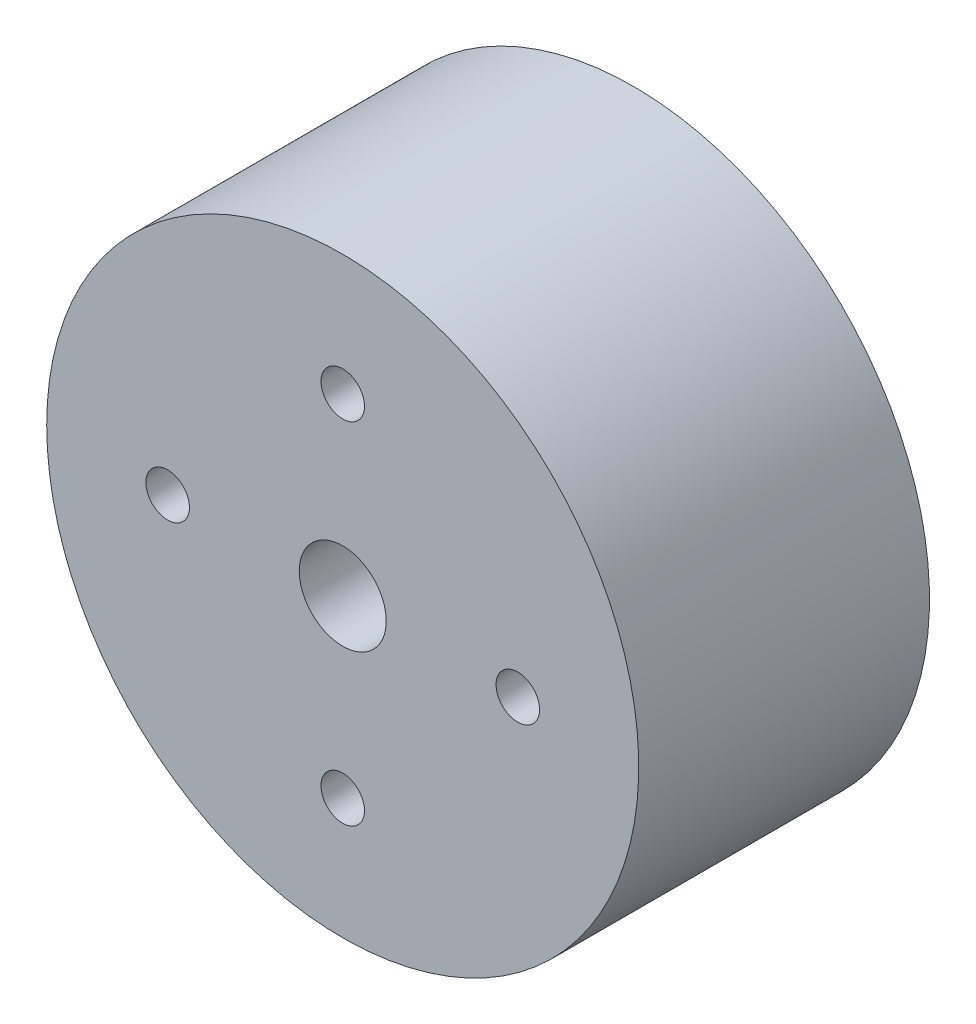
ISO-10303-21;
HEADER;
FILE_DESCRIPTION(('STEP AP214'),'2;1');
FILE_NAME('part.step','',(''),(''),'','','');
FILE_SCHEMA(('AUTOMOTIVE_DESIGN { 1 0 10303 214 1 1 1 1 }'));
ENDSEC;
DATA;
#1=APPLICATION_CONTEXT('core data for automotive mechanical design processes');
#2=APPLICATION_PROTOCOL_DEFINITION('international standard','automotive_design',2000,#1);
#3=PRODUCT_CONTEXT('',#1,'mechanical');
#4=PRODUCT('Part','Part','',(#3));
#5=PRODUCT_RELATED_PRODUCT_CATEGORY('part','',(#4));
#6=PRODUCT_DEFINITION_FORMATION('','',#4);
#7=PRODUCT_DEFINITION_CONTEXT('part definition',#1,'design');
#8=PRODUCT_DEFINITION('design','',#6,#7);
#9=PRODUCT_DEFINITION_SHAPE('','',#8);
#10=(LENGTH_UNIT() NAMED_UNIT(*) SI_UNIT(.MILLI.,.METRE.));
#11=(NAMED_UNIT(*) PLANE_ANGLE_UNIT() SI_UNIT($,.RADIAN.));
#12=(NAMED_UNIT(*) SI_UNIT($,.STERADIAN.) SOLID_ANGLE_UNIT());
#13=UNCERTAINTY_MEASURE_WITH_UNIT(LENGTH_MEASURE(1.E-05),#10,'distance_accuracy_value','');
#14=(GEOMETRIC_REPRESENTATION_CONTEXT(3) GLOBAL_UNCERTAINTY_ASSIGNED_CONTEXT((#13)) GLOBAL_UNIT_ASSIGNED_CONTEXT((#10,
#11,#12)) REPRESENTATION_CONTEXT('',''));
#15=CARTESIAN_POINT('',(0.,0.,0.));
#16=DIRECTION('',(0.,0.,1.));
#17=DIRECTION('',(1.,0.,0.));
#18=AXIS2_PLACEMENT_3D('',#15,#16,#17);
#19=CARTESIAN_POINT('',(0.,0.,13.7));
#20=DIRECTION('',(0.,0.,1.));
#21=DIRECTION('',(1.,0.,0.));
#22=AXIS2_PLACEMENT_3D('',#19,#20,#21);
#23=PLANE('',#22);
#24=CARTESIAN_POINT('',(0.,8.25,13.7));
#25=DIRECTION('',(0.,0.,1.));
#26=DIRECTION('',(1.,0.,0.));
#27=AXIS2_PLACEMENT_3D('',#24,#25,#26);
#28=CIRCLE('',#27,1.025);
#29=CARTESIAN_POINT('',(1.025,8.25,13.7));
#30=VERTEX_POINT('',#29);
#31=EDGE_CURVE('E74',#30,#30,#28,.T.);
#32=ORIENTED_EDGE('',*,*,#31,.F.);
#33=EDGE_LOOP('',(#32));
#34=FACE_BOUND('',#33,.T.);
#35=CARTESIAN_POINT('',(8.25,0.,13.7));
#36=DIRECTION('',(0.,0.,1.));
#37=DIRECTION('',(1.,0.,0.));
#38=AXIS2_PLACEMENT_3D('',#35,#36,#37);
#39=CIRCLE('',#38,1.025);
#40=CARTESIAN_POINT('',(9.275,0.,13.7));
#41=VERTEX_POINT('',#40);
#42=EDGE_CURVE('E68',#41,#41,#39,.T.);
#43=ORIENTED_EDGE('',*,*,#42,.F.);
#44=EDGE_LOOP('',(#43));
#45=FACE_BOUND('',#44,.T.);
#46=CARTESIAN_POINT('',(0.,-8.25,13.7));
#47=DIRECTION('',(0.,0.,1.));
#48=DIRECTION('',(1.,0.,0.));
#49=AXIS2_PLACEMENT_3D('',#46,#47,#48);
#50=CIRCLE('',#49,1.025);
#51=CARTESIAN_POINT('',(1.025,-8.25,13.7));
#52=VERTEX_POINT('',#51);
#53=EDGE_CURVE('E62',#52,#52,#50,.T.);
#54=ORIENTED_EDGE('',*,*,#53,.F.);
#55=EDGE_LOOP('',(#54));
#56=FACE_BOUND('',#55,.T.);
#57=CARTESIAN_POINT('',(-8.25,0.,13.7));
#58=DIRECTION('',(0.,0.,1.));
#59=DIRECTION('',(1.,0.,0.));
#60=AXIS2_PLACEMENT_3D('',#57,#58,#59);
#61=CIRCLE('',#60,1.025);
#62=CARTESIAN_POINT('',(-7.225,0.,13.7));
#63=VERTEX_POINT('',#62);
#64=EDGE_CURVE('E56',#63,#63,#61,.T.);
#65=ORIENTED_EDGE('',*,*,#64,.F.);
#66=EDGE_LOOP('',(#65));
#67=FACE_BOUND('',#66,.T.);
#68=CARTESIAN_POINT('',(0.,0.,13.7));
#69=DIRECTION('',(0.,0.,1.));
#70=DIRECTION('',(1.,0.,0.));
#71=AXIS2_PLACEMENT_3D('',#68,#69,#70);
#72=CIRCLE('',#71,13.95);
#73=CARTESIAN_POINT('',(-13.95,0.,13.7));
#74=VERTEX_POINT('',#73);
#75=EDGE_CURVE('E10',#74,#74,#72,.T.);
#76=ORIENTED_EDGE('',*,*,#75,.T.);
#77=EDGE_LOOP('',(#76));
#78=FACE_BOUND('',#77,.T.);
#79=CARTESIAN_POINT('',(0.,0.,13.7));
#80=DIRECTION('',(0.,0.,1.));
#81=DIRECTION('',(1.,0.,0.));
#82=AXIS2_PLACEMENT_3D('',#79,#80,#81);
#83=CIRCLE('',#82,2.05);
#84=CARTESIAN_POINT('',(-2.05,0.,13.7));
#85=VERTEX_POINT('',#84);
#86=EDGE_CURVE('E46',#85,#85,#83,.T.);
#87=ORIENTED_EDGE('',*,*,#86,.F.);
#88=EDGE_LOOP('',(#87));
#89=FACE_BOUND('',#88,.T.);
#90=ADVANCED_FACE('F35',(#34,#45,#56,#67,#78,#89),#23,.T.);
#91=CARTESIAN_POINT('',(0.,0.,0.));
#92=DIRECTION('',(0.,0.,1.));
#93=DIRECTION('',(1.,0.,0.));
#94=AXIS2_PLACEMENT_3D('',#91,#92,#93);
#95=PLANE('',#94);
#96=CARTESIAN_POINT('',(0.,8.25,0.));
#97=DIRECTION('',(0.,0.,1.));
#98=DIRECTION('',(1.,0.,0.));
#99=AXIS2_PLACEMENT_3D('',#96,#97,#98);
#100=CIRCLE('',#99,1.025);
#101=CARTESIAN_POINT('',(1.025,8.25,0.));
#102=VERTEX_POINT('',#101);
#103=EDGE_CURVE('E71',#102,#102,#100,.T.);
#104=ORIENTED_EDGE('',*,*,#103,.T.);
#105=EDGE_LOOP('',(#104));
#106=FACE_BOUND('',#105,.T.);
#107=CARTESIAN_POINT('',(8.25,0.,0.));
#108=DIRECTION('',(0.,0.,1.));
#109=DIRECTION('',(1.,0.,0.));
#110=AXIS2_PLACEMENT_3D('',#107,#108,#109);
#111=CIRCLE('',#110,1.025);
#112=CARTESIAN_POINT('',(9.275,0.,0.));
#113=VERTEX_POINT('',#112);
#114=EDGE_CURVE('E65',#113,#113,#111,.T.);
#115=ORIENTED_EDGE('',*,*,#114,.T.);
#116=EDGE_LOOP('',(#115));
#117=FACE_BOUND('',#116,.T.);
#118=CARTESIAN_POINT('',(0.,-8.25,0.));
#119=DIRECTION('',(0.,0.,1.));
#120=DIRECTION('',(1.,0.,0.));
#121=AXIS2_PLACEMENT_3D('',#118,#119,#120);
#122=CIRCLE('',#121,1.025);
#123=CARTESIAN_POINT('',(1.025,-8.25,0.));
#124=VERTEX_POINT('',#123);
#125=EDGE_CURVE('E59',#124,#124,#122,.T.);
#126=ORIENTED_EDGE('',*,*,#125,.T.);
#127=EDGE_LOOP('',(#126));
#128=FACE_BOUND('',#127,.T.);
#129=CARTESIAN_POINT('',(-8.25,0.,0.));
#130=DIRECTION('',(0.,0.,1.));
#131=DIRECTION('',(1.,0.,0.));
#132=AXIS2_PLACEMENT_3D('',#129,#130,#131);
#133=CIRCLE('',#132,1.025);
#134=CARTESIAN_POINT('',(-7.225,0.,0.));
#135=VERTEX_POINT('',#134);
#136=EDGE_CURVE('E51',#135,#135,#133,.T.);
#137=ORIENTED_EDGE('',*,*,#136,.T.);
#138=EDGE_LOOP('',(#137));
#139=FACE_BOUND('',#138,.T.);
#140=CARTESIAN_POINT('',(0.,0.,0.));
#141=DIRECTION('',(0.,0.,1.));
#142=DIRECTION('',(1.,0.,0.));
#143=AXIS2_PLACEMENT_3D('',#140,#141,#142);
#144=CIRCLE('',#143,13.95);
#145=CARTESIAN_POINT('',(-13.95,0.,0.));
#146=VERTEX_POINT('',#145);
#147=EDGE_CURVE('E39',#146,#146,#144,.T.);
#148=ORIENTED_EDGE('',*,*,#147,.F.);
#149=EDGE_LOOP('',(#148));
#150=FACE_BOUND('',#149,.T.);
#151=CARTESIAN_POINT('',(0.,0.,0.));
#152=DIRECTION('',(0.,0.,1.));
#153=DIRECTION('',(1.,0.,0.));
#154=AXIS2_PLACEMENT_3D('',#151,#152,#153);
#155=CIRCLE('',#154,2.05);
#156=CARTESIAN_POINT('',(-2.05,0.,0.));
#157=VERTEX_POINT('',#156);
#158=EDGE_CURVE('E48',#157,#157,#155,.T.);
#159=ORIENTED_EDGE('',*,*,#158,.T.);
#160=EDGE_LOOP('',(#159));
#161=FACE_BOUND('',#160,.T.);
#162=ADVANCED_FACE('F82',(#106,#117,#128,#139,#150,#161),#95,.F.);
#163=CARTESIAN_POINT('',(0.,0.,13.7));
#164=DIRECTION('',(0.,0.,-1.));
#165=DIRECTION('',(-1.,0.,0.));
#166=AXIS2_PLACEMENT_3D('',#163,#164,#165);
#167=CYLINDRICAL_SURFACE('',#166,13.95);
#168=CARTESIAN_POINT('',(-13.95,0.,13.7));
#169=CARTESIAN_POINT('',(-13.95,0.,13.5572916666667));
#170=CARTESIAN_POINT('',(-13.95,0.,13.4145833333333));
#171=CARTESIAN_POINT('',(-13.95,0.,13.1291666666667));
#172=CARTESIAN_POINT('',(-13.95,0.,12.9864583333333));
#173=CARTESIAN_POINT('',(-13.95,0.,12.7010416666667));
#174=CARTESIAN_POINT('',(-13.95,0.,12.5583333333333));
#175=CARTESIAN_POINT('',(-13.95,0.,12.2729166666667));
#176=CARTESIAN_POINT('',(-13.95,0.,12.1302083333333));
#177=CARTESIAN_POINT('',(-13.95,0.,11.8447916666667));
#178=CARTESIAN_POINT('',(-13.95,0.,11.7020833333333));
#179=CARTESIAN_POINT('',(-13.95,0.,11.4166666666667));
#180=CARTESIAN_POINT('',(-13.95,0.,11.2739583333333));
#181=CARTESIAN_POINT('',(-13.95,0.,10.9885416666667));
#182=CARTESIAN_POINT('',(-13.95,0.,10.8458333333333));
#183=CARTESIAN_POINT('',(-13.95,0.,10.5604166666667));
#184=CARTESIAN_POINT('',(-13.95,0.,10.4177083333333));
#185=CARTESIAN_POINT('',(-13.95,0.,10.1322916666667));
#186=CARTESIAN_POINT('',(-13.95,0.,9.98958333333333));
#187=CARTESIAN_POINT('',(-13.95,0.,9.70416666666666));
#188=CARTESIAN_POINT('',(-13.95,0.,9.56145833333333));
#189=CARTESIAN_POINT('',(-13.95,0.,9.27604166666666));
#190=CARTESIAN_POINT('',(-13.95,0.,9.13333333333333));
#191=CARTESIAN_POINT('',(-13.95,0.,8.84791666666666));
#192=CARTESIAN_POINT('',(-13.95,0.,8.70520833333333));
#193=CARTESIAN_POINT('',(-13.95,0.,8.41979166666667));
#194=CARTESIAN_POINT('',(-13.95,0.,8.27708333333333));
#195=CARTESIAN_POINT('',(-13.95,0.,7.99166666666667));
#196=CARTESIAN_POINT('',(-13.95,0.,7.84895833333333));
#197=CARTESIAN_POINT('',(-13.95,0.,7.56354166666667));
#198=CARTESIAN_POINT('',(-13.95,0.,7.42083333333333));
#199=CARTESIAN_POINT('',(-13.95,0.,7.13541666666667));
#200=CARTESIAN_POINT('',(-13.95,0.,6.99270833333333));
#201=CARTESIAN_POINT('',(-13.95,0.,6.70729166666667));
#202=CARTESIAN_POINT('',(-13.95,0.,6.56458333333333));
#203=CARTESIAN_POINT('',(-13.95,0.,6.27916666666667));
#204=CARTESIAN_POINT('',(-13.95,0.,6.13645833333333));
#205=CARTESIAN_POINT('',(-13.95,0.,5.85104166666667));
#206=CARTESIAN_POINT('',(-13.95,0.,5.70833333333333));
#207=CARTESIAN_POINT('',(-13.95,0.,5.42291666666667));
#208=CARTESIAN_POINT('',(-13.95,0.,5.28020833333333));
#209=CARTESIAN_POINT('',(-13.95,0.,4.99479166666667));
#210=CARTESIAN_POINT('',(-13.95,0.,4.85208333333333));
#211=CARTESIAN_POINT('',(-13.95,0.,4.56666666666667));
#212=CARTESIAN_POINT('',(-13.95,0.,4.42395833333333));
#213=CARTESIAN_POINT('',(-13.95,0.,4.13854166666667));
#214=CARTESIAN_POINT('',(-13.95,0.,3.99583333333333));
#215=CARTESIAN_POINT('',(-13.95,0.,3.71041666666667));
#216=CARTESIAN_POINT('',(-13.95,0.,3.56770833333333));
#217=CARTESIAN_POINT('',(-13.95,0.,3.28229166666667));
#218=CARTESIAN_POINT('',(-13.95,0.,3.13958333333333));
#219=CARTESIAN_POINT('',(-13.95,0.,2.85416666666667));
#220=CARTESIAN_POINT('',(-13.95,0.,2.71145833333333));
#221=CARTESIAN_POINT('',(-13.95,0.,2.42604166666667));
#222=CARTESIAN_POINT('',(-13.95,0.,2.28333333333333));
#223=CARTESIAN_POINT('',(-13.95,0.,1.99791666666667));
#224=CARTESIAN_POINT('',(-13.95,0.,1.85520833333333));
#225=CARTESIAN_POINT('',(-13.95,0.,1.56979166666667));
#226=CARTESIAN_POINT('',(-13.95,0.,1.42708333333333));
#227=CARTESIAN_POINT('',(-13.95,0.,1.14166666666667));
#228=CARTESIAN_POINT('',(-13.95,0.,0.998958333333333));
#229=CARTESIAN_POINT('',(-13.95,0.,0.713541666666666));
#230=CARTESIAN_POINT('',(-13.95,0.,0.570833333333333));
#231=CARTESIAN_POINT('',(-13.95,0.,0.285416666666666));
#232=CARTESIAN_POINT('',(-13.95,0.,0.142708333333333));
#233=CARTESIAN_POINT('',(-13.95,0.,0.));
#234=B_SPLINE_CURVE_WITH_KNOTS('',3,(#168,#169,#170,#171,#172,#173,#174,#175,#176,#177,#178,
#179,#180,#181,#182,#183,#184,#185,#186,#187,#188,#189,#190,#191,#192,#193,#194,#195,#196,#197,
#198,#199,#200,#201,#202,#203,#204,#205,#206,#207,#208,#209,#210,#211,#212,#213,#214,#215,#216,
#217,#218,#219,#220,#221,#222,#223,#224,#225,#226,#227,#228,#229,#230,#231,#232,#233),
.UNSPECIFIED.,.F.,.F.,(4,2,2,2,2,2,2,2,2,2,2,2,2,2,2,2,2,2,2,2,2,2,2,2,2,2,2,2,2,2,2,2,4),(0.,
0.428125000000001,0.856250000000001,1.284375,1.7125,2.140625,2.56875,2.996875,3.425,3.853125,
4.28125,4.709375,5.1375,5.565625,5.99375,6.421875,6.85,7.278125,7.70625,8.134375,8.5625,
8.990625,9.41875,9.846875,10.275,10.703125,11.13125,11.559375,11.9875,12.415625,12.84375,
13.271875,13.7),.UNSPECIFIED.);
#235=EDGE_CURVE('BSEAM37',#74,#146,#234,.T.);
#236=ORIENTED_EDGE('',*,*,#75,.F.);
#237=ORIENTED_EDGE('',*,*,#147,.T.);
#238=ORIENTED_EDGE('',*,*,#235,.T.);
#239=ORIENTED_EDGE('',*,*,#235,.F.);
#240=EDGE_LOOP('',(#236,#238,#237,#239));
#241=FACE_BOUND('',#240,.T.);
#242=ADVANCED_FACE('F37',(#241),#167,.T.);
#243=CARTESIAN_POINT('',(0.,0.,13.7));
#244=DIRECTION('',(0.,0.,-1.));
#245=DIRECTION('',(-1.,0.,0.));
#246=AXIS2_PLACEMENT_3D('',#243,#244,#245);
#247=CYLINDRICAL_SURFACE('',#246,2.05);
#248=CARTESIAN_POINT('',(-2.05,0.,13.7));
#249=CARTESIAN_POINT('',(-2.05,0.,13.5572916666667));
#250=CARTESIAN_POINT('',(-2.05,0.,13.4145833333333));
#251=CARTESIAN_POINT('',(-2.05,0.,13.1291666666667));
#252=CARTESIAN_POINT('',(-2.05,0.,12.9864583333333));
#253=CARTESIAN_POINT('',(-2.05,0.,12.7010416666667));
#254=CARTESIAN_POINT('',(-2.05,0.,12.5583333333333));
#255=CARTESIAN_POINT('',(-2.05,0.,12.2729166666667));
#256=CARTESIAN_POINT('',(-2.05,0.,12.1302083333333));
#257=CARTESIAN_POINT('',(-2.05,0.,11.8447916666667));
#258=CARTESIAN_POINT('',(-2.05,0.,11.7020833333333));
#259=CARTESIAN_POINT('',(-2.05,0.,11.4166666666667));
#260=CARTESIAN_POINT('',(-2.05,0.,11.2739583333333));
#261=CARTESIAN_POINT('',(-2.05,0.,10.9885416666667));
#262=CARTESIAN_POINT('',(-2.05,0.,10.8458333333333));
#263=CARTESIAN_POINT('',(-2.05,0.,10.5604166666667));
#264=CARTESIAN_POINT('',(-2.05,0.,10.4177083333333));
#265=CARTESIAN_POINT('',(-2.05,0.,10.1322916666667));
#266=CARTESIAN_POINT('',(-2.05,0.,9.98958333333333));
#267=CARTESIAN_POINT('',(-2.05,0.,9.70416666666666));
#268=CARTESIAN_POINT('',(-2.05,0.,9.56145833333333));
#269=CARTESIAN_POINT('',(-2.05,0.,9.27604166666666));
#270=CARTESIAN_POINT('',(-2.05,0.,9.13333333333333));
#271=CARTESIAN_POINT('',(-2.05,0.,8.84791666666666));
#272=CARTESIAN_POINT('',(-2.05,0.,8.70520833333333));
#273=CARTESIAN_POINT('',(-2.05,0.,8.41979166666667));
#274=CARTESIAN_POINT('',(-2.05,0.,8.27708333333333));
#275=CARTESIAN_POINT('',(-2.05,0.,7.99166666666667));
#276=CARTESIAN_POINT('',(-2.05,0.,7.84895833333333));
#277=CARTESIAN_POINT('',(-2.05,0.,7.56354166666667));
#278=CARTESIAN_POINT('',(-2.05,0.,7.42083333333333));
#279=CARTESIAN_POINT('',(-2.05,0.,7.13541666666667));
#280=CARTESIAN_POINT('',(-2.05,0.,6.99270833333333));
#281=CARTESIAN_POINT('',(-2.05,0.,6.70729166666667));
#282=CARTESIAN_POINT('',(-2.05,0.,6.56458333333333));
#283=CARTESIAN_POINT('',(-2.05,0.,6.27916666666667));
#284=CARTESIAN_POINT('',(-2.05,0.,6.13645833333333));
#285=CARTESIAN_POINT('',(-2.05,0.,5.85104166666667));
#286=CARTESIAN_POINT('',(-2.05,0.,5.70833333333333));
#287=CARTESIAN_POINT('',(-2.05,0.,5.42291666666667));
#288=CARTESIAN_POINT('',(-2.05,0.,5.28020833333333));
#289=CARTESIAN_POINT('',(-2.05,0.,4.99479166666667));
#290=CARTESIAN_POINT('',(-2.05,0.,4.85208333333333));
#291=CARTESIAN_POINT('',(-2.05,0.,4.56666666666667));
#292=CARTESIAN_POINT('',(-2.05,0.,4.42395833333333));
#293=CARTESIAN_POINT('',(-2.05,0.,4.13854166666667));
#294=CARTESIAN_POINT('',(-2.05,0.,3.99583333333333));
#295=CARTESIAN_POINT('',(-2.05,0.,3.71041666666667));
#296=CARTESIAN_POINT('',(-2.05,0.,3.56770833333333));
#297=CARTESIAN_POINT('',(-2.05,0.,3.28229166666667));
#298=CARTESIAN_POINT('',(-2.05,0.,3.13958333333333));
#299=CARTESIAN_POINT('',(-2.05,0.,2.85416666666667));
#300=CARTESIAN_POINT('',(-2.05,0.,2.71145833333333));
#301=CARTESIAN_POINT('',(-2.05,0.,2.42604166666667));
#302=CARTESIAN_POINT('',(-2.05,0.,2.28333333333333));
#303=CARTESIAN_POINT('',(-2.05,0.,1.99791666666667));
#304=CARTESIAN_POINT('',(-2.05,0.,1.85520833333333));
#305=CARTESIAN_POINT('',(-2.05,0.,1.56979166666667));
#306=CARTESIAN_POINT('',(-2.05,0.,1.42708333333333));
#307=CARTESIAN_POINT('',(-2.05,0.,1.14166666666667));
#308=CARTESIAN_POINT('',(-2.05,0.,0.998958333333333));
#309=CARTESIAN_POINT('',(-2.05,0.,0.713541666666666));
#310=CARTESIAN_POINT('',(-2.05,0.,0.570833333333333));
#311=CARTESIAN_POINT('',(-2.05,0.,0.285416666666666));
#312=CARTESIAN_POINT('',(-2.05,0.,0.142708333333333));
#313=CARTESIAN_POINT('',(-2.05,0.,0.));
#314=B_SPLINE_CURVE_WITH_KNOTS('',3,(#248,#249,#250,#251,#252,#253,#254,#255,#256,#257,#258,
#259,#260,#261,#262,#263,#264,#265,#266,#267,#268,#269,#270,#271,#272,#273,#274,#275,#276,#277,
#278,#279,#280,#281,#282,#283,#284,#285,#286,#287,#288,#289,#290,#291,#292,#293,#294,#295,#296,
#297,#298,#299,#300,#301,#302,#303,#304,#305,#306,#307,#308,#309,#310,#311,#312,#313),
.UNSPECIFIED.,.F.,.F.,(4,2,2,2,2,2,2,2,2,2,2,2,2,2,2,2,2,2,2,2,2,2,2,2,2,2,2,2,2,2,2,2,4),(0.,
0.428125000000001,0.856250000000001,1.284375,1.7125,2.140625,2.56875,2.996875,3.425,3.853125,
4.28125,4.709375,5.1375,5.565625,5.99375,6.421875,6.85,7.278125,7.70625,8.134375,8.5625,
8.990625,9.41875,9.846875,10.275,10.703125,11.13125,11.559375,11.9875,12.415625,12.84375,
13.271875,13.7),.UNSPECIFIED.);
#315=EDGE_CURVE('BSEAM92',#85,#157,#314,.T.);
#316=ORIENTED_EDGE('',*,*,#86,.T.);
#317=ORIENTED_EDGE('',*,*,#158,.F.);
#318=ORIENTED_EDGE('',*,*,#315,.T.);
#319=ORIENTED_EDGE('',*,*,#315,.F.);
#320=EDGE_LOOP('',(#316,#318,#317,#319));
#321=FACE_BOUND('',#320,.T.);
#322=ADVANCED_FACE('F92',(#321),#247,.F.);
#323=CARTESIAN_POINT('',(-8.25,0.,13.7));
#324=DIRECTION('',(0.,0.,1.));
#325=DIRECTION('',(1.,0.,0.));
#326=AXIS2_PLACEMENT_3D('',#323,#324,#325);
#327=CYLINDRICAL_SURFACE('',#326,1.025);
#328=ORIENTED_EDGE('',*,*,#136,.F.);
#329=EDGE_LOOP('',(#328));
#330=FACE_BOUND('',#329,.T.);
#331=ORIENTED_EDGE('',*,*,#64,.T.);
#332=EDGE_LOOP('',(#331));
#333=FACE_BOUND('',#332,.T.);
#334=ADVANCED_FACE('F95',(#330,#333),#327,.F.);
#335=CARTESIAN_POINT('',(0.,-8.25,13.7));
#336=DIRECTION('',(0.,0.,1.));
#337=DIRECTION('',(1.,0.,0.));
#338=AXIS2_PLACEMENT_3D('',#335,#336,#337);
#339=CYLINDRICAL_SURFACE('',#338,1.025);
#340=ORIENTED_EDGE('',*,*,#125,.F.);
#341=EDGE_LOOP('',(#340));
#342=FACE_BOUND('',#341,.T.);
#343=ORIENTED_EDGE('',*,*,#53,.T.);
#344=EDGE_LOOP('',(#343));
#345=FACE_BOUND('',#344,.T.);
#346=ADVANCED_FACE('F109',(#342,#345),#339,.F.);
#347=CARTESIAN_POINT('',(8.25,0.,13.7));
#348=DIRECTION('',(0.,0.,1.));
#349=DIRECTION('',(1.,0.,0.));
#350=AXIS2_PLACEMENT_3D('',#347,#348,#349);
#351=CYLINDRICAL_SURFACE('',#350,1.025);
#352=ORIENTED_EDGE('',*,*,#114,.F.);
#353=EDGE_LOOP('',(#352));
#354=FACE_BOUND('',#353,.T.);
#355=ORIENTED_EDGE('',*,*,#42,.T.);
#356=EDGE_LOOP('',(#355));
#357=FACE_BOUND('',#356,.T.);
#358=ADVANCED_FACE('F113',(#354,#357),#351,.F.);
#359=CARTESIAN_POINT('',(0.,8.25,13.7));
#360=DIRECTION('',(0.,0.,1.));
#361=DIRECTION('',(1.,0.,0.));
#362=AXIS2_PLACEMENT_3D('',#359,#360,#361);
#363=CYLINDRICAL_SURFACE('',#362,1.025);
#364=ORIENTED_EDGE('',*,*,#103,.F.);
#365=EDGE_LOOP('',(#364));
#366=FACE_BOUND('',#365,.T.);
#367=ORIENTED_EDGE('',*,*,#31,.T.);
#368=EDGE_LOOP('',(#367));
#369=FACE_BOUND('',#368,.T.);
#370=ADVANCED_FACE('F78',(#366,#369),#363,.F.);
#371=CLOSED_SHELL('',(#90,#162,#242,#322,#334,#346,#358,#370));
#372=MANIFOLD_SOLID_BREP('B2',#371);
#373=ADVANCED_BREP_SHAPE_REPRESENTATION('',(#18,#372),#14);
#374=SHAPE_DEFINITION_REPRESENTATION(#9,#373);
ENDSEC;
END-ISO-10303-21;
